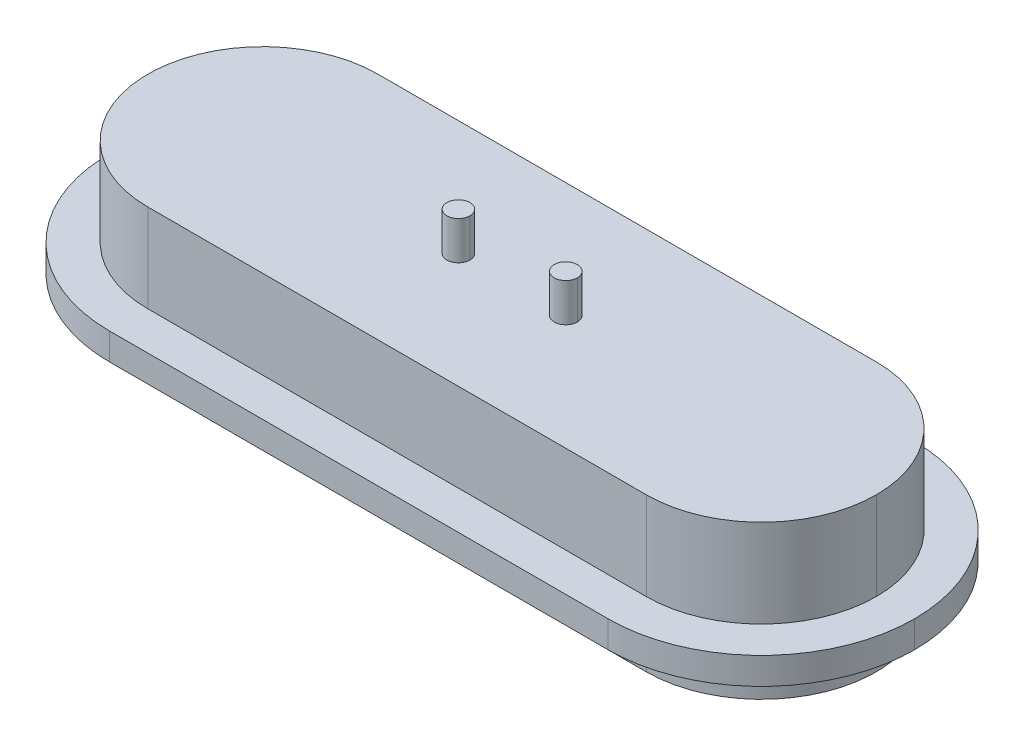
ISO-10303-21;
HEADER;
FILE_DESCRIPTION(('STEP AP214'),'2;1');
FILE_NAME('part.step','',(''),(''),'','','');
FILE_SCHEMA(('AUTOMOTIVE_DESIGN { 1 0 10303 214 1 1 1 1 }'));
ENDSEC;
DATA;
#1=APPLICATION_CONTEXT('core data for automotive mechanical design processes');
#2=APPLICATION_PROTOCOL_DEFINITION('international standard','automotive_design',2000,#1);
#3=PRODUCT_CONTEXT('',#1,'mechanical');
#4=PRODUCT('Part','Part','',(#3));
#5=PRODUCT_RELATED_PRODUCT_CATEGORY('part','',(#4));
#6=PRODUCT_DEFINITION_FORMATION('','',#4);
#7=PRODUCT_DEFINITION_CONTEXT('part definition',#1,'design');
#8=PRODUCT_DEFINITION('design','',#6,#7);
#9=PRODUCT_DEFINITION_SHAPE('','',#8);
#10=(LENGTH_UNIT() NAMED_UNIT(*) SI_UNIT(.MILLI.,.METRE.));
#11=(NAMED_UNIT(*) PLANE_ANGLE_UNIT() SI_UNIT($,.RADIAN.));
#12=(NAMED_UNIT(*) SI_UNIT($,.STERADIAN.) SOLID_ANGLE_UNIT());
#13=UNCERTAINTY_MEASURE_WITH_UNIT(LENGTH_MEASURE(1.E-05),#10,'distance_accuracy_value','');
#14=(GEOMETRIC_REPRESENTATION_CONTEXT(3) GLOBAL_UNCERTAINTY_ASSIGNED_CONTEXT((#13)) GLOBAL_UNIT_ASSIGNED_CONTEXT((#10,
#11,#12)) REPRESENTATION_CONTEXT('',''));
#15=CARTESIAN_POINT('',(0.,0.,0.));
#16=DIRECTION('',(0.,0.,1.));
#17=DIRECTION('',(1.,0.,0.));
#18=AXIS2_PLACEMENT_3D('',#15,#16,#17);
#19=CARTESIAN_POINT('',(-79.4,-62.2625,-2.0116));
#20=DIRECTION('',(0.,-1.,0.));
#21=DIRECTION('',(1.,0.,0.));
#22=AXIS2_PLACEMENT_3D('',#19,#20,#21);
#23=CYLINDRICAL_SURFACE('',#22,0.3);
#24=DIRECTION('',(0.,-1.,0.));
#25=VECTOR('',#24,1.);
#26=CARTESIAN_POINT('',(-79.7,-62.2625,-2.0116));
#27=LINE('',#26,#25);
#28=CARTESIAN_POINT('',(-79.7,-62.2625,-2.0116));
#29=VERTEX_POINT('',#28);
#30=CARTESIAN_POINT('',(-79.7,-63.2625,-2.0116));
#31=VERTEX_POINT('',#30);
#32=EDGE_CURVE('E405',#29,#31,#27,.T.);
#33=ORIENTED_EDGE('',*,*,#32,.F.);
#34=CARTESIAN_POINT('',(-79.4,-62.2625,-2.0116));
#35=DIRECTION('',(0.,-1.,0.));
#36=DIRECTION('',(1.,0.,0.));
#37=AXIS2_PLACEMENT_3D('',#34,#35,#36);
#38=CIRCLE('',#37,0.3);
#39=CARTESIAN_POINT('',(-79.1,-62.2625,-2.0116));
#40=VERTEX_POINT('',#39);
#41=EDGE_CURVE('E11',#29,#40,#38,.T.);
#42=ORIENTED_EDGE('',*,*,#41,.T.);
#43=DIRECTION('',(0.,-1.,0.));
#44=VECTOR('',#43,1.);
#45=CARTESIAN_POINT('',(-79.1,-62.2625,-2.0116));
#46=LINE('',#45,#44);
#47=CARTESIAN_POINT('',(-79.1,-63.2625,-2.0116));
#48=VERTEX_POINT('',#47);
#49=EDGE_CURVE('E413',#40,#48,#46,.T.);
#50=ORIENTED_EDGE('',*,*,#49,.T.);
#51=CARTESIAN_POINT('',(-79.4,-63.2625,-2.0116));
#52=DIRECTION('',(0.,-1.,0.));
#53=DIRECTION('',(-1.,0.,0.));
#54=AXIS2_PLACEMENT_3D('',#51,#52,#53);
#55=CIRCLE('',#54,0.3);
#56=EDGE_CURVE('E295',#31,#48,#55,.T.);
#57=ORIENTED_EDGE('',*,*,#56,.F.);
#58=EDGE_LOOP('',(#33,#42,#50,#57));
#59=FACE_BOUND('',#58,.T.);
#60=ADVANCED_FACE('F16',(#59),#23,.T.);
#61=CARTESIAN_POINT('',(-79.4,-62.2625,-2.0116));
#62=DIRECTION('',(0.,-1.,0.));
#63=DIRECTION('',(0.,0.,-1.));
#64=AXIS2_PLACEMENT_3D('',#61,#62,#63);
#65=PLANE('',#64);
#66=CARTESIAN_POINT('',(-79.4,-62.2625,-2.0116));
#67=DIRECTION('',(0.,-1.,0.));
#68=DIRECTION('',(1.,0.,0.));
#69=AXIS2_PLACEMENT_3D('',#66,#67,#68);
#70=CIRCLE('',#69,0.3);
#71=EDGE_CURVE('E401',#40,#29,#70,.T.);
#72=ORIENTED_EDGE('',*,*,#71,.F.);
#73=ORIENTED_EDGE('',*,*,#41,.F.);
#74=EDGE_LOOP('',(#72,#73));
#75=FACE_BOUND('',#74,.T.);
#76=ADVANCED_FACE('F810',(#75),#65,.F.);
#77=CARTESIAN_POINT('',(-76.6,-62.2625,-2.0116));
#78=DIRECTION('',(0.,-1.,0.));
#79=DIRECTION('',(1.,0.,0.));
#80=AXIS2_PLACEMENT_3D('',#77,#78,#79);
#81=CYLINDRICAL_SURFACE('',#80,0.3);
#82=DIRECTION('',(0.,-1.,0.));
#83=VECTOR('',#82,1.);
#84=CARTESIAN_POINT('',(-76.9,-62.2625,-2.0116));
#85=LINE('',#84,#83);
#86=CARTESIAN_POINT('',(-76.9,-62.2625,-2.0116));
#87=VERTEX_POINT('',#86);
#88=CARTESIAN_POINT('',(-76.9,-63.2625,-2.0116));
#89=VERTEX_POINT('',#88);
#90=EDGE_CURVE('E357',#87,#89,#85,.T.);
#91=ORIENTED_EDGE('',*,*,#90,.F.);
#92=CARTESIAN_POINT('',(-76.6,-62.2625,-2.0116));
#93=DIRECTION('',(0.,-1.,0.));
#94=DIRECTION('',(1.,0.,0.));
#95=AXIS2_PLACEMENT_3D('',#92,#93,#94);
#96=CIRCLE('',#95,0.3);
#97=CARTESIAN_POINT('',(-76.3,-62.2625,-2.0116));
#98=VERTEX_POINT('',#97);
#99=EDGE_CURVE('E27',#87,#98,#96,.T.);
#100=ORIENTED_EDGE('',*,*,#99,.T.);
#101=DIRECTION('',(0.,-1.,0.));
#102=VECTOR('',#101,1.);
#103=CARTESIAN_POINT('',(-76.3,-62.2625,-2.0116));
#104=LINE('',#103,#102);
#105=CARTESIAN_POINT('',(-76.3,-63.2625,-2.0116));
#106=VERTEX_POINT('',#105);
#107=EDGE_CURVE('E286',#98,#106,#104,.T.);
#108=ORIENTED_EDGE('',*,*,#107,.T.);
#109=CARTESIAN_POINT('',(-76.6,-63.2625,-2.0116));
#110=DIRECTION('',(0.,-1.,0.));
#111=DIRECTION('',(-1.,0.,0.));
#112=AXIS2_PLACEMENT_3D('',#109,#110,#111);
#113=CIRCLE('',#112,0.3);
#114=EDGE_CURVE('E292',#89,#106,#113,.T.);
#115=ORIENTED_EDGE('',*,*,#114,.F.);
#116=EDGE_LOOP('',(#91,#100,#108,#115));
#117=FACE_BOUND('',#116,.T.);
#118=ADVANCED_FACE('F18',(#117),#81,.T.);
#119=CARTESIAN_POINT('',(-76.6,-62.2625,-2.0116));
#120=DIRECTION('',(0.,-1.,0.));
#121=DIRECTION('',(0.,0.,-1.));
#122=AXIS2_PLACEMENT_3D('',#119,#120,#121);
#123=PLANE('',#122);
#124=CARTESIAN_POINT('',(-76.6,-62.2625,-2.0116));
#125=DIRECTION('',(0.,-1.,0.));
#126=DIRECTION('',(1.,0.,0.));
#127=AXIS2_PLACEMENT_3D('',#124,#125,#126);
#128=CIRCLE('',#127,0.3);
#129=EDGE_CURVE('E361',#98,#87,#128,.T.);
#130=ORIENTED_EDGE('',*,*,#129,.F.);
#131=ORIENTED_EDGE('',*,*,#99,.F.);
#132=EDGE_LOOP('',(#130,#131));
#133=FACE_BOUND('',#132,.T.);
#134=ADVANCED_FACE('F809',(#133),#123,.F.);
#135=CARTESIAN_POINT('',(-71.5,-63.2625,-2.0116));
#136=DIRECTION('',(0.,1.,0.));
#137=DIRECTION('',(1.,0.,0.));
#138=AXIS2_PLACEMENT_3D('',#135,#136,#137);
#139=PLANE('',#138);
#140=CARTESIAN_POINT('',(-71.5,-63.2625,-2.0116));
#141=DIRECTION('',(0.,1.,0.));
#142=DIRECTION('',(-1.,0.,0.));
#143=AXIS2_PLACEMENT_3D('',#140,#141,#142);
#144=CIRCLE('',#143,3.);
#145=CARTESIAN_POINT('',(-71.5,-63.2625,0.9884));
#146=VERTEX_POINT('',#145);
#147=CARTESIAN_POINT('',(-68.5,-63.2625,-2.0116));
#148=VERTEX_POINT('',#147);
#149=EDGE_CURVE('E304',#146,#148,#144,.T.);
#150=ORIENTED_EDGE('',*,*,#149,.T.);
#151=CARTESIAN_POINT('',(-71.5,-63.2625,-2.0116));
#152=DIRECTION('',(0.,1.,0.));
#153=DIRECTION('',(-1.,0.,0.));
#154=AXIS2_PLACEMENT_3D('',#151,#152,#153);
#155=CIRCLE('',#154,3.);
#156=CARTESIAN_POINT('',(-71.5,-63.2625,-5.0116));
#157=VERTEX_POINT('',#156);
#158=EDGE_CURVE('E279',#148,#157,#155,.T.);
#159=ORIENTED_EDGE('',*,*,#158,.T.);
#160=DIRECTION('',(-1.,0.,0.));
#161=VECTOR('',#160,1.);
#162=CARTESIAN_POINT('',(-71.5,-63.2625,-5.0116));
#163=LINE('',#162,#161);
#164=CARTESIAN_POINT('',(-84.5,-63.2625,-5.0116));
#165=VERTEX_POINT('',#164);
#166=EDGE_CURVE('E347',#157,#165,#163,.T.);
#167=ORIENTED_EDGE('',*,*,#166,.T.);
#168=CARTESIAN_POINT('',(-84.5,-63.2625,-2.0116));
#169=DIRECTION('',(0.,1.,0.));
#170=DIRECTION('',(-1.,0.,0.));
#171=AXIS2_PLACEMENT_3D('',#168,#169,#170);
#172=CIRCLE('',#171,3.);
#173=CARTESIAN_POINT('',(-84.5,-63.2625,0.9884));
#174=VERTEX_POINT('',#173);
#175=EDGE_CURVE('E364',#165,#174,#172,.T.);
#176=ORIENTED_EDGE('',*,*,#175,.T.);
#177=DIRECTION('',(1.,0.,0.));
#178=VECTOR('',#177,1.);
#179=CARTESIAN_POINT('',(-71.5,-63.2625,0.9884));
#180=LINE('',#179,#178);
#181=EDGE_CURVE('E40',#174,#146,#180,.T.);
#182=ORIENTED_EDGE('',*,*,#181,.T.);
#183=EDGE_LOOP('',(#150,#159,#167,#176,#182));
#184=FACE_BOUND('',#183,.T.);
#185=CARTESIAN_POINT('',(-76.6,-63.2625,-2.0116));
#186=DIRECTION('',(0.,-1.,0.));
#187=DIRECTION('',(-1.,0.,0.));
#188=AXIS2_PLACEMENT_3D('',#185,#186,#187);
#189=CIRCLE('',#188,0.3);
#190=EDGE_CURVE('E360',#106,#89,#189,.T.);
#191=ORIENTED_EDGE('',*,*,#190,.T.);
#192=ORIENTED_EDGE('',*,*,#114,.T.);
#193=EDGE_LOOP('',(#191,#192));
#194=FACE_BOUND('',#193,.T.);
#195=CARTESIAN_POINT('',(-79.4,-63.2625,-2.0116));
#196=DIRECTION('',(0.,-1.,0.));
#197=DIRECTION('',(-1.,0.,0.));
#198=AXIS2_PLACEMENT_3D('',#195,#196,#197);
#199=CIRCLE('',#198,0.3);
#200=EDGE_CURVE('E409',#48,#31,#199,.T.);
#201=ORIENTED_EDGE('',*,*,#200,.T.);
#202=ORIENTED_EDGE('',*,*,#56,.T.);
#203=EDGE_LOOP('',(#201,#202));
#204=FACE_BOUND('',#203,.T.);
#205=ADVANCED_FACE('F904',(#184,#194,#204),#139,.T.);
#206=CARTESIAN_POINT('',(-71.5,-63.2625,0.9884));
#207=DIRECTION('',(0.,0.,-1.));
#208=DIRECTION('',(0.,-1.,0.));
#209=AXIS2_PLACEMENT_3D('',#206,#207,#208);
#210=PLANE('',#209);
#211=DIRECTION('',(1.,0.,0.));
#212=VECTOR('',#211,1.);
#213=CARTESIAN_POINT('',(-71.5,-65.5625,0.9884));
#214=LINE('',#213,#212);
#215=CARTESIAN_POINT('',(-84.5,-65.5625,0.9884));
#216=VERTEX_POINT('',#215);
#217=CARTESIAN_POINT('',(-71.5,-65.5625,0.9884));
#218=VERTEX_POINT('',#217);
#219=EDGE_CURVE('E262',#216,#218,#214,.T.);
#220=ORIENTED_EDGE('',*,*,#219,.T.);
#221=DIRECTION('',(0.,-1.,0.));
#222=VECTOR('',#221,1.);
#223=CARTESIAN_POINT('',(-71.5,-63.2625,0.9884));
#224=LINE('',#223,#222);
#225=EDGE_CURVE('E257',#146,#218,#224,.T.);
#226=ORIENTED_EDGE('',*,*,#225,.F.);
#227=ORIENTED_EDGE('',*,*,#181,.F.);
#228=DIRECTION('',(0.,-1.,0.));
#229=VECTOR('',#228,1.);
#230=CARTESIAN_POINT('',(-84.5,-63.2625,0.9884));
#231=LINE('',#230,#229);
#232=EDGE_CURVE('E351',#174,#216,#231,.T.);
#233=ORIENTED_EDGE('',*,*,#232,.T.);
#234=EDGE_LOOP('',(#220,#226,#227,#233));
#235=FACE_BOUND('',#234,.T.);
#236=ADVANCED_FACE('F575',(#235),#210,.F.);
#237=CARTESIAN_POINT('',(-84.5,-63.2625,-2.0116));
#238=DIRECTION('',(0.,-1.,0.));
#239=DIRECTION('',(1.,0.,0.));
#240=AXIS2_PLACEMENT_3D('',#237,#238,#239);
#241=CYLINDRICAL_SURFACE('',#240,3.);
#242=CARTESIAN_POINT('',(-84.5,-65.5625,-2.0116));
#243=DIRECTION('',(0.,1.,0.));
#244=DIRECTION('',(-1.,0.,0.));
#245=AXIS2_PLACEMENT_3D('',#242,#243,#244);
#246=CIRCLE('',#245,3.);
#247=CARTESIAN_POINT('',(-84.5,-65.5625,-5.0116));
#248=VERTEX_POINT('',#247);
#249=EDGE_CURVE('E553',#248,#216,#246,.T.);
#250=ORIENTED_EDGE('',*,*,#249,.T.);
#251=ORIENTED_EDGE('',*,*,#232,.F.);
#252=ORIENTED_EDGE('',*,*,#175,.F.);
#253=DIRECTION('',(0.,-1.,0.));
#254=VECTOR('',#253,1.);
#255=CARTESIAN_POINT('',(-84.5,-63.2625,-5.0116));
#256=LINE('',#255,#254);
#257=EDGE_CURVE('E344',#165,#248,#256,.T.);
#258=ORIENTED_EDGE('',*,*,#257,.T.);
#259=EDGE_LOOP('',(#250,#251,#252,#258));
#260=FACE_BOUND('',#259,.T.);
#261=ADVANCED_FACE('F573',(#260),#241,.T.);
#262=CARTESIAN_POINT('',(-71.5,-63.2625,-5.0116));
#263=DIRECTION('',(0.,0.,1.));
#264=DIRECTION('',(0.,-1.,0.));
#265=AXIS2_PLACEMENT_3D('',#262,#263,#264);
#266=PLANE('',#265);
#267=DIRECTION('',(-1.,0.,0.));
#268=VECTOR('',#267,1.);
#269=CARTESIAN_POINT('',(-71.5,-65.5625,-5.0116));
#270=LINE('',#269,#268);
#271=CARTESIAN_POINT('',(-71.5,-65.5625,-5.0116));
#272=VERTEX_POINT('',#271);
#273=EDGE_CURVE('E263',#272,#248,#270,.T.);
#274=ORIENTED_EDGE('',*,*,#273,.T.);
#275=ORIENTED_EDGE('',*,*,#257,.F.);
#276=ORIENTED_EDGE('',*,*,#166,.F.);
#277=DIRECTION('',(0.,-1.,0.));
#278=VECTOR('',#277,1.);
#279=CARTESIAN_POINT('',(-71.5,-63.2625,-5.0116));
#280=LINE('',#279,#278);
#281=EDGE_CURVE('E275',#157,#272,#280,.T.);
#282=ORIENTED_EDGE('',*,*,#281,.T.);
#283=EDGE_LOOP('',(#274,#275,#276,#282));
#284=FACE_BOUND('',#283,.T.);
#285=ADVANCED_FACE('F874',(#284),#266,.F.);
#286=CARTESIAN_POINT('',(-71.5,-63.2625,-2.0116));
#287=DIRECTION('',(0.,-1.,0.));
#288=DIRECTION('',(1.,0.,0.));
#289=AXIS2_PLACEMENT_3D('',#286,#287,#288);
#290=CYLINDRICAL_SURFACE('',#289,3.);
#291=DIRECTION('',(0.,-1.,0.));
#292=VECTOR('',#291,1.);
#293=CARTESIAN_POINT('',(-68.5,-63.2625,-2.0116));
#294=LINE('',#293,#292);
#295=CARTESIAN_POINT('',(-68.5,-65.5625,-2.0116));
#296=VERTEX_POINT('',#295);
#297=EDGE_CURVE('E255',#148,#296,#294,.T.);
#298=ORIENTED_EDGE('',*,*,#297,.F.);
#299=ORIENTED_EDGE('',*,*,#149,.F.);
#300=ORIENTED_EDGE('',*,*,#225,.T.);
#301=CARTESIAN_POINT('',(-71.5,-65.5625,-2.0116));
#302=DIRECTION('',(0.,1.,0.));
#303=DIRECTION('',(-1.,0.,0.));
#304=AXIS2_PLACEMENT_3D('',#301,#302,#303);
#305=CIRCLE('',#304,3.);
#306=EDGE_CURVE('E250',#218,#296,#305,.T.);
#307=ORIENTED_EDGE('',*,*,#306,.T.);
#308=EDGE_LOOP('',(#298,#299,#300,#307));
#309=FACE_BOUND('',#308,.T.);
#310=ADVANCED_FACE('F252',(#309),#290,.T.);
#311=CARTESIAN_POINT('',(-73.,-67.1125,-2.0116));
#312=DIRECTION('',(0.,-1.,0.));
#313=DIRECTION('',(0.,0.,-1.));
#314=AXIS2_PLACEMENT_3D('',#311,#312,#313);
#315=PLANE('',#314);
#316=CARTESIAN_POINT('',(-73.,-67.1125,-2.0116));
#317=DIRECTION('',(0.,-1.,0.));
#318=DIRECTION('',(1.,0.,0.));
#319=AXIS2_PLACEMENT_3D('',#316,#317,#318);
#320=CIRCLE('',#319,1.25);
#321=CARTESIAN_POINT('',(-71.75,-67.1125,-2.0116));
#322=VERTEX_POINT('',#321);
#323=CARTESIAN_POINT('',(-74.25,-67.1125,-2.0116));
#324=VERTEX_POINT('',#323);
#325=EDGE_CURVE('E302',#322,#324,#320,.T.);
#326=ORIENTED_EDGE('',*,*,#325,.T.);
#327=CARTESIAN_POINT('',(-73.,-67.1125,-2.0116));
#328=DIRECTION('',(0.,-1.,0.));
#329=DIRECTION('',(1.,0.,0.));
#330=AXIS2_PLACEMENT_3D('',#327,#328,#329);
#331=CIRCLE('',#330,1.25);
#332=EDGE_CURVE('E427',#324,#322,#331,.T.);
#333=ORIENTED_EDGE('',*,*,#332,.T.);
#334=EDGE_LOOP('',(#326,#333));
#335=FACE_BOUND('',#334,.T.);
#336=ADVANCED_FACE('F971',(#335),#315,.T.);
#337=CARTESIAN_POINT('',(-73.,-67.1125,-2.0116));
#338=DIRECTION('',(0.,-1.,0.));
#339=DIRECTION('',(1.,0.,0.));
#340=AXIS2_PLACEMENT_3D('',#337,#338,#339);
#341=CYLINDRICAL_SURFACE('',#340,1.25);
#342=DIRECTION('',(0.,-1.,0.));
#343=VECTOR('',#342,1.);
#344=CARTESIAN_POINT('',(-74.25,-67.1125,-2.0116));
#345=LINE('',#344,#343);
#346=CARTESIAN_POINT('',(-74.25,-67.2625,-2.0116));
#347=VERTEX_POINT('',#346);
#348=EDGE_CURVE('E434',#324,#347,#345,.T.);
#349=ORIENTED_EDGE('',*,*,#348,.F.);
#350=ORIENTED_EDGE('',*,*,#325,.F.);
#351=DIRECTION('',(0.,-1.,0.));
#352=VECTOR('',#351,1.);
#353=CARTESIAN_POINT('',(-71.75,-67.1125,-2.0116));
#354=LINE('',#353,#352);
#355=CARTESIAN_POINT('',(-71.75,-67.2625,-2.0116));
#356=VERTEX_POINT('',#355);
#357=EDGE_CURVE('E440',#322,#356,#354,.T.);
#358=ORIENTED_EDGE('',*,*,#357,.T.);
#359=CARTESIAN_POINT('',(-73.,-67.2625,-2.0116));
#360=DIRECTION('',(0.,-1.,0.));
#361=DIRECTION('',(1.,0.,0.));
#362=AXIS2_PLACEMENT_3D('',#359,#360,#361);
#363=CIRCLE('',#362,1.25);
#364=EDGE_CURVE('E428',#356,#347,#363,.T.);
#365=ORIENTED_EDGE('',*,*,#364,.T.);
#366=EDGE_LOOP('',(#349,#350,#358,#365));
#367=FACE_BOUND('',#366,.T.);
#368=ADVANCED_FACE('F895',(#367),#341,.F.);
#369=CARTESIAN_POINT('',(-83.,-67.1125,-2.0116));
#370=DIRECTION('',(0.,1.,0.));
#371=DIRECTION('',(1.,0.,0.));
#372=AXIS2_PLACEMENT_3D('',#369,#370,#371);
#373=PLANE('',#372);
#374=CARTESIAN_POINT('',(-83.,-67.1125,-2.0116));
#375=DIRECTION('',(0.,-1.,0.));
#376=DIRECTION('',(-1.,0.,0.));
#377=AXIS2_PLACEMENT_3D('',#374,#375,#376);
#378=CIRCLE('',#377,1.25);
#379=CARTESIAN_POINT('',(-81.75,-67.1125,-2.0116));
#380=VERTEX_POINT('',#379);
#381=CARTESIAN_POINT('',(-84.25,-67.1125,-2.0116));
#382=VERTEX_POINT('',#381);
#383=EDGE_CURVE('E305',#380,#382,#378,.T.);
#384=ORIENTED_EDGE('',*,*,#383,.T.);
#385=CARTESIAN_POINT('',(-83.,-67.1125,-2.0116));
#386=DIRECTION('',(0.,-1.,0.));
#387=DIRECTION('',(-1.,0.,0.));
#388=AXIS2_PLACEMENT_3D('',#385,#386,#387);
#389=CIRCLE('',#388,1.25);
#390=EDGE_CURVE('E397',#382,#380,#389,.T.);
#391=ORIENTED_EDGE('',*,*,#390,.T.);
#392=EDGE_LOOP('',(#384,#391));
#393=FACE_BOUND('',#392,.T.);
#394=ADVANCED_FACE('F891',(#393),#373,.F.);
#395=CARTESIAN_POINT('',(-83.,-67.1125,-2.0116));
#396=DIRECTION('',(0.,-1.,0.));
#397=DIRECTION('',(1.,0.,0.));
#398=AXIS2_PLACEMENT_3D('',#395,#396,#397);
#399=CYLINDRICAL_SURFACE('',#398,1.25);
#400=DIRECTION('',(0.,-1.,0.));
#401=VECTOR('',#400,1.);
#402=CARTESIAN_POINT('',(-84.25,-67.1125,-2.0116));
#403=LINE('',#402,#401);
#404=CARTESIAN_POINT('',(-84.25,-67.2625,-2.0116));
#405=VERTEX_POINT('',#404);
#406=EDGE_CURVE('E393',#382,#405,#403,.T.);
#407=ORIENTED_EDGE('',*,*,#406,.F.);
#408=ORIENTED_EDGE('',*,*,#383,.F.);
#409=DIRECTION('',(0.,-1.,0.));
#410=VECTOR('',#409,1.);
#411=CARTESIAN_POINT('',(-81.75,-67.1125,-2.0116));
#412=LINE('',#411,#410);
#413=CARTESIAN_POINT('',(-81.75,-67.2625,-2.0116));
#414=VERTEX_POINT('',#413);
#415=EDGE_CURVE('E336',#380,#414,#412,.T.);
#416=ORIENTED_EDGE('',*,*,#415,.T.);
#417=CARTESIAN_POINT('',(-83.,-67.2625,-2.0116));
#418=DIRECTION('',(0.,-1.,0.));
#419=DIRECTION('',(-1.,0.,0.));
#420=AXIS2_PLACEMENT_3D('',#417,#418,#419);
#421=CIRCLE('',#420,1.25);
#422=EDGE_CURVE('E334',#414,#405,#421,.T.);
#423=ORIENTED_EDGE('',*,*,#422,.T.);
#424=EDGE_LOOP('',(#407,#408,#416,#423));
#425=FACE_BOUND('',#424,.T.);
#426=ADVANCED_FACE('F886',(#425),#399,.F.);
#427=CARTESIAN_POINT('',(-79.4,-67.1125,-2.0116));
#428=DIRECTION('',(0.,1.,0.));
#429=DIRECTION('',(1.,0.,0.));
#430=AXIS2_PLACEMENT_3D('',#427,#428,#429);
#431=PLANE('',#430);
#432=CARTESIAN_POINT('',(-79.4,-67.1125,-2.0116));
#433=DIRECTION('',(0.,-1.,0.));
#434=DIRECTION('',(-1.,0.,0.));
#435=AXIS2_PLACEMENT_3D('',#432,#433,#434);
#436=CIRCLE('',#435,0.75);
#437=CARTESIAN_POINT('',(-78.65,-67.1125,-2.0116));
#438=VERTEX_POINT('',#437);
#439=CARTESIAN_POINT('',(-80.15,-67.1125,-2.0116));
#440=VERTEX_POINT('',#439);
#441=EDGE_CURVE('E306',#438,#440,#436,.T.);
#442=ORIENTED_EDGE('',*,*,#441,.T.);
#443=CARTESIAN_POINT('',(-79.4,-67.1125,-2.0116));
#444=DIRECTION('',(0.,-1.,0.));
#445=DIRECTION('',(-1.,0.,0.));
#446=AXIS2_PLACEMENT_3D('',#443,#444,#445);
#447=CIRCLE('',#446,0.75);
#448=EDGE_CURVE('E340',#440,#438,#447,.T.);
#449=ORIENTED_EDGE('',*,*,#448,.T.);
#450=EDGE_LOOP('',(#442,#449));
#451=FACE_BOUND('',#450,.T.);
#452=ADVANCED_FACE('F521',(#451),#431,.F.);
#453=CARTESIAN_POINT('',(-79.4,-67.1125,-2.0116));
#454=DIRECTION('',(0.,-1.,0.));
#455=DIRECTION('',(1.,0.,0.));
#456=AXIS2_PLACEMENT_3D('',#453,#454,#455);
#457=CYLINDRICAL_SURFACE('',#456,0.75);
#458=DIRECTION('',(0.,-1.,0.));
#459=VECTOR('',#458,1.);
#460=CARTESIAN_POINT('',(-80.15,-67.1125,-2.0116));
#461=LINE('',#460,#459);
#462=CARTESIAN_POINT('',(-80.15,-67.2625,-2.0116));
#463=VERTEX_POINT('',#462);
#464=EDGE_CURVE('E380',#440,#463,#461,.T.);
#465=ORIENTED_EDGE('',*,*,#464,.F.);
#466=ORIENTED_EDGE('',*,*,#441,.F.);
#467=DIRECTION('',(0.,-1.,0.));
#468=VECTOR('',#467,1.);
#469=CARTESIAN_POINT('',(-78.65,-67.1125,-2.0116));
#470=LINE('',#469,#468);
#471=CARTESIAN_POINT('',(-78.65,-67.2625,-2.0116));
#472=VERTEX_POINT('',#471);
#473=EDGE_CURVE('E475',#438,#472,#470,.T.);
#474=ORIENTED_EDGE('',*,*,#473,.T.);
#475=CARTESIAN_POINT('',(-79.4,-67.2625,-2.0116));
#476=DIRECTION('',(0.,-1.,0.));
#477=DIRECTION('',(-1.,0.,0.));
#478=AXIS2_PLACEMENT_3D('',#475,#476,#477);
#479=CIRCLE('',#478,0.75);
#480=EDGE_CURVE('E331',#472,#463,#479,.T.);
#481=ORIENTED_EDGE('',*,*,#480,.T.);
#482=EDGE_LOOP('',(#465,#466,#474,#481));
#483=FACE_BOUND('',#482,.T.);
#484=ADVANCED_FACE('F820',(#483),#457,.F.);
#485=CARTESIAN_POINT('',(-76.6,-67.1125,-2.0116));
#486=DIRECTION('',(0.,-1.,0.));
#487=DIRECTION('',(0.,0.,-1.));
#488=AXIS2_PLACEMENT_3D('',#485,#486,#487);
#489=PLANE('',#488);
#490=CARTESIAN_POINT('',(-76.6,-67.1125,-2.0116));
#491=DIRECTION('',(0.,-1.,0.));
#492=DIRECTION('',(1.,0.,0.));
#493=AXIS2_PLACEMENT_3D('',#490,#491,#492);
#494=CIRCLE('',#493,0.75);
#495=CARTESIAN_POINT('',(-75.85,-67.1125,-2.0116));
#496=VERTEX_POINT('',#495);
#497=CARTESIAN_POINT('',(-77.35,-67.1125,-2.0116));
#498=VERTEX_POINT('',#497);
#499=EDGE_CURVE('E308',#496,#498,#494,.T.);
#500=ORIENTED_EDGE('',*,*,#499,.T.);
#501=CARTESIAN_POINT('',(-76.6,-67.1125,-2.0116));
#502=DIRECTION('',(0.,-1.,0.));
#503=DIRECTION('',(1.,0.,0.));
#504=AXIS2_PLACEMENT_3D('',#501,#502,#503);
#505=CIRCLE('',#504,0.75);
#506=EDGE_CURVE('E514',#498,#496,#505,.T.);
#507=ORIENTED_EDGE('',*,*,#506,.T.);
#508=EDGE_LOOP('',(#500,#507));
#509=FACE_BOUND('',#508,.T.);
#510=ADVANCED_FACE('F815',(#509),#489,.T.);
#511=CARTESIAN_POINT('',(-76.6,-67.1125,-2.0116));
#512=DIRECTION('',(0.,-1.,0.));
#513=DIRECTION('',(1.,0.,0.));
#514=AXIS2_PLACEMENT_3D('',#511,#512,#513);
#515=CYLINDRICAL_SURFACE('',#514,0.75);
#516=DIRECTION('',(0.,-1.,0.));
#517=VECTOR('',#516,1.);
#518=CARTESIAN_POINT('',(-77.35,-67.1125,-2.0116));
#519=LINE('',#518,#517);
#520=CARTESIAN_POINT('',(-77.35,-67.2625,-2.0116));
#521=VERTEX_POINT('',#520);
#522=EDGE_CURVE('E509',#498,#521,#519,.T.);
#523=ORIENTED_EDGE('',*,*,#522,.F.);
#524=ORIENTED_EDGE('',*,*,#499,.F.);
#525=DIRECTION('',(0.,-1.,0.));
#526=VECTOR('',#525,1.);
#527=CARTESIAN_POINT('',(-75.85,-67.1125,-2.0116));
#528=LINE('',#527,#526);
#529=CARTESIAN_POINT('',(-75.85,-67.2625,-2.0116));
#530=VERTEX_POINT('',#529);
#531=EDGE_CURVE('E329',#496,#530,#528,.T.);
#532=ORIENTED_EDGE('',*,*,#531,.T.);
#533=CARTESIAN_POINT('',(-76.6,-67.2625,-2.0116));
#534=DIRECTION('',(0.,-1.,0.));
#535=DIRECTION('',(1.,0.,0.));
#536=AXIS2_PLACEMENT_3D('',#533,#534,#535);
#537=CIRCLE('',#536,0.75);
#538=EDGE_CURVE('E333',#530,#521,#537,.T.);
#539=ORIENTED_EDGE('',*,*,#538,.T.);
#540=EDGE_LOOP('',(#523,#524,#532,#539));
#541=FACE_BOUND('',#540,.T.);
#542=ADVANCED_FACE('F819',(#541),#515,.F.);
#543=CARTESIAN_POINT('',(-71.5,-65.5625,1.9884));
#544=DIRECTION('',(0.,0.,-1.));
#545=DIRECTION('',(0.,-1.,0.));
#546=AXIS2_PLACEMENT_3D('',#543,#544,#545);
#547=PLANE('',#546);
#548=DIRECTION('',(1.,0.,0.));
#549=VECTOR('',#548,1.);
#550=CARTESIAN_POINT('',(-71.5,-66.2625,1.9884));
#551=LINE('',#550,#549);
#552=CARTESIAN_POINT('',(-84.5,-66.2625,1.9884));
#553=VERTEX_POINT('',#552);
#554=CARTESIAN_POINT('',(-71.5,-66.2625,1.9884));
#555=VERTEX_POINT('',#554);
#556=EDGE_CURVE('E471',#553,#555,#551,.T.);
#557=ORIENTED_EDGE('',*,*,#556,.T.);
#558=DIRECTION('',(0.,-1.,0.));
#559=VECTOR('',#558,1.);
#560=CARTESIAN_POINT('',(-71.5,-65.5625,1.9884));
#561=LINE('',#560,#559);
#562=CARTESIAN_POINT('',(-71.5,-65.5625,1.9884));
#563=VERTEX_POINT('',#562);
#564=EDGE_CURVE('E447',#563,#555,#561,.T.);
#565=ORIENTED_EDGE('',*,*,#564,.F.);
#566=DIRECTION('',(1.,0.,0.));
#567=VECTOR('',#566,1.);
#568=CARTESIAN_POINT('',(-71.5,-65.5625,1.9884));
#569=LINE('',#568,#567);
#570=CARTESIAN_POINT('',(-84.5,-65.5625,1.9884));
#571=VERTEX_POINT('',#570);
#572=EDGE_CURVE('E435',#571,#563,#569,.T.);
#573=ORIENTED_EDGE('',*,*,#572,.F.);
#574=DIRECTION('',(0.,-1.,0.));
#575=VECTOR('',#574,1.);
#576=CARTESIAN_POINT('',(-84.5,-65.5625,1.9884));
#577=LINE('',#576,#575);
#578=EDGE_CURVE('E317',#571,#553,#577,.T.);
#579=ORIENTED_EDGE('',*,*,#578,.T.);
#580=EDGE_LOOP('',(#557,#565,#573,#579));
#581=FACE_BOUND('',#580,.T.);
#582=ADVANCED_FACE('F1049',(#581),#547,.F.);
#583=CARTESIAN_POINT('',(-84.5,-65.5625,-2.0116));
#584=DIRECTION('',(0.,-1.,0.));
#585=DIRECTION('',(1.,0.,0.));
#586=AXIS2_PLACEMENT_3D('',#583,#584,#585);
#587=CYLINDRICAL_SURFACE('',#586,4.);
#588=CARTESIAN_POINT('',(-84.5,-66.2625,-2.0116));
#589=DIRECTION('',(0.,1.,0.));
#590=DIRECTION('',(-1.,0.,0.));
#591=AXIS2_PLACEMENT_3D('',#588,#589,#590);
#592=CIRCLE('',#591,4.);
#593=CARTESIAN_POINT('',(-84.5,-66.2625,-6.0116));
#594=VERTEX_POINT('',#593);
#595=EDGE_CURVE('E480',#594,#553,#592,.T.);
#596=ORIENTED_EDGE('',*,*,#595,.T.);
#597=ORIENTED_EDGE('',*,*,#578,.F.);
#598=CARTESIAN_POINT('',(-84.5,-65.5625,-2.0116));
#599=DIRECTION('',(0.,1.,0.));
#600=DIRECTION('',(-1.,0.,0.));
#601=AXIS2_PLACEMENT_3D('',#598,#599,#600);
#602=CIRCLE('',#601,4.);
#603=CARTESIAN_POINT('',(-84.5,-65.5625,-6.0116));
#604=VERTEX_POINT('',#603);
#605=EDGE_CURVE('E439',#604,#571,#602,.T.);
#606=ORIENTED_EDGE('',*,*,#605,.F.);
#607=DIRECTION('',(0.,-1.,0.));
#608=VECTOR('',#607,1.);
#609=CARTESIAN_POINT('',(-84.5,-65.5625,-6.0116));
#610=LINE('',#609,#608);
#611=EDGE_CURVE('E325',#604,#594,#610,.T.);
#612=ORIENTED_EDGE('',*,*,#611,.T.);
#613=EDGE_LOOP('',(#596,#597,#606,#612));
#614=FACE_BOUND('',#613,.T.);
#615=ADVANCED_FACE('F829',(#614),#587,.T.);
#616=CARTESIAN_POINT('',(-71.5,-65.5625,-6.0116));
#617=DIRECTION('',(0.,0.,1.));
#618=DIRECTION('',(0.,-1.,0.));
#619=AXIS2_PLACEMENT_3D('',#616,#617,#618);
#620=PLANE('',#619);
#621=DIRECTION('',(-1.,0.,0.));
#622=VECTOR('',#621,1.);
#623=CARTESIAN_POINT('',(-71.5,-66.2625,-6.0116));
#624=LINE('',#623,#622);
#625=CARTESIAN_POINT('',(-71.5,-66.2625,-6.0116));
#626=VERTEX_POINT('',#625);
#627=EDGE_CURVE('E476',#626,#594,#624,.T.);
#628=ORIENTED_EDGE('',*,*,#627,.T.);
#629=ORIENTED_EDGE('',*,*,#611,.F.);
#630=DIRECTION('',(-1.,0.,0.));
#631=VECTOR('',#630,1.);
#632=CARTESIAN_POINT('',(-71.5,-65.5625,-6.0116));
#633=LINE('',#632,#631);
#634=CARTESIAN_POINT('',(-71.5,-65.5625,-6.0116));
#635=VERTEX_POINT('',#634);
#636=EDGE_CURVE('E419',#635,#604,#633,.T.);
#637=ORIENTED_EDGE('',*,*,#636,.F.);
#638=DIRECTION('',(0.,-1.,0.));
#639=VECTOR('',#638,1.);
#640=CARTESIAN_POINT('',(-71.5,-65.5625,-6.0116));
#641=LINE('',#640,#639);
#642=EDGE_CURVE('E550',#635,#626,#641,.T.);
#643=ORIENTED_EDGE('',*,*,#642,.T.);
#644=EDGE_LOOP('',(#628,#629,#637,#643));
#645=FACE_BOUND('',#644,.T.);
#646=ADVANCED_FACE('F824',(#645),#620,.F.);
#647=CARTESIAN_POINT('',(-71.5,-65.5625,-2.0116));
#648=DIRECTION('',(0.,-1.,0.));
#649=DIRECTION('',(1.,0.,0.));
#650=AXIS2_PLACEMENT_3D('',#647,#648,#649);
#651=CYLINDRICAL_SURFACE('',#650,4.);
#652=DIRECTION('',(0.,-1.,0.));
#653=VECTOR('',#652,1.);
#654=CARTESIAN_POINT('',(-67.5,-65.5625,-2.0116));
#655=LINE('',#654,#653);
#656=CARTESIAN_POINT('',(-67.5,-65.5625,-2.0116));
#657=VERTEX_POINT('',#656);
#658=CARTESIAN_POINT('',(-67.5,-66.2625,-2.0116));
#659=VERTEX_POINT('',#658);
#660=EDGE_CURVE('E420',#657,#659,#655,.T.);
#661=ORIENTED_EDGE('',*,*,#660,.F.);
#662=CARTESIAN_POINT('',(-71.5,-65.5625,-2.0116));
#663=DIRECTION('',(0.,1.,0.));
#664=DIRECTION('',(-1.,0.,0.));
#665=AXIS2_PLACEMENT_3D('',#662,#663,#664);
#666=CIRCLE('',#665,4.);
#667=EDGE_CURVE('E389',#563,#657,#666,.T.);
#668=ORIENTED_EDGE('',*,*,#667,.F.);
#669=ORIENTED_EDGE('',*,*,#564,.T.);
#670=CARTESIAN_POINT('',(-71.5,-66.2625,-2.0116));
#671=DIRECTION('',(0.,1.,0.));
#672=DIRECTION('',(-1.,0.,0.));
#673=AXIS2_PLACEMENT_3D('',#670,#671,#672);
#674=CIRCLE('',#673,4.);
#675=EDGE_CURVE('E468',#555,#659,#674,.T.);
#676=ORIENTED_EDGE('',*,*,#675,.T.);
#677=EDGE_LOOP('',(#661,#668,#669,#676));
#678=FACE_BOUND('',#677,.T.);
#679=ADVANCED_FACE('F828',(#678),#651,.T.);
#680=CARTESIAN_POINT('',(-71.5,-66.2625,-2.0116));
#681=DIRECTION('',(0.,1.,0.));
#682=DIRECTION('',(1.,0.,0.));
#683=AXIS2_PLACEMENT_3D('',#680,#681,#682);
#684=PLANE('',#683);
#685=DIRECTION('',(1.,0.,0.));
#686=VECTOR('',#685,1.);
#687=CARTESIAN_POINT('',(-71.5,-66.2625,0.9884));
#688=LINE('',#687,#686);
#689=CARTESIAN_POINT('',(-84.5,-66.2625,0.9884));
#690=VERTEX_POINT('',#689);
#691=CARTESIAN_POINT('',(-71.5,-66.2625,0.9884));
#692=VERTEX_POINT('',#691);
#693=EDGE_CURVE('E301',#690,#692,#688,.T.);
#694=ORIENTED_EDGE('',*,*,#693,.T.);
#695=CARTESIAN_POINT('',(-71.5,-66.2625,-2.0116));
#696=DIRECTION('',(0.,1.,0.));
#697=DIRECTION('',(-1.,0.,0.));
#698=AXIS2_PLACEMENT_3D('',#695,#696,#697);
#699=CIRCLE('',#698,3.);
#700=CARTESIAN_POINT('',(-71.5,-66.2625,-5.0116));
#701=VERTEX_POINT('',#700);
#702=EDGE_CURVE('E554',#692,#701,#699,.T.);
#703=ORIENTED_EDGE('',*,*,#702,.T.);
#704=DIRECTION('',(-1.,0.,0.));
#705=VECTOR('',#704,1.);
#706=CARTESIAN_POINT('',(-71.5,-66.2625,-5.0116));
#707=LINE('',#706,#705);
#708=CARTESIAN_POINT('',(-84.5,-66.2625,-5.0116));
#709=VERTEX_POINT('',#708);
#710=EDGE_CURVE('E352',#701,#709,#707,.T.);
#711=ORIENTED_EDGE('',*,*,#710,.T.);
#712=CARTESIAN_POINT('',(-84.5,-66.2625,-2.0116));
#713=DIRECTION('',(0.,1.,0.));
#714=DIRECTION('',(-1.,0.,0.));
#715=AXIS2_PLACEMENT_3D('',#712,#713,#714);
#716=CIRCLE('',#715,3.);
#717=CARTESIAN_POINT('',(-87.5,-66.2625,-2.0116));
#718=VERTEX_POINT('',#717);
#719=EDGE_CURVE('E290',#709,#718,#716,.T.);
#720=ORIENTED_EDGE('',*,*,#719,.T.);
#721=CARTESIAN_POINT('',(-84.5,-66.2625,-2.0116));
#722=DIRECTION('',(0.,1.,0.));
#723=DIRECTION('',(-1.,0.,0.));
#724=AXIS2_PLACEMENT_3D('',#721,#722,#723);
#725=CIRCLE('',#724,3.);
#726=EDGE_CURVE('E356',#718,#690,#725,.T.);
#727=ORIENTED_EDGE('',*,*,#726,.T.);
#728=EDGE_LOOP('',(#694,#703,#711,#720,#727));
#729=FACE_BOUND('',#728,.T.);
#730=ORIENTED_EDGE('',*,*,#675,.F.);
#731=ORIENTED_EDGE('',*,*,#556,.F.);
#732=ORIENTED_EDGE('',*,*,#595,.F.);
#733=ORIENTED_EDGE('',*,*,#627,.F.);
#734=CARTESIAN_POINT('',(-71.5,-66.2625,-2.0116));
#735=DIRECTION('',(0.,1.,0.));
#736=DIRECTION('',(-1.,0.,0.));
#737=AXIS2_PLACEMENT_3D('',#734,#735,#736);
#738=CIRCLE('',#737,4.);
#739=EDGE_CURVE('E378',#659,#626,#738,.T.);
#740=ORIENTED_EDGE('',*,*,#739,.F.);
#741=EDGE_LOOP('',(#730,#731,#732,#733,#740));
#742=FACE_BOUND('',#741,.T.);
#743=ADVANCED_FACE('F840',(#729,#742),#684,.F.);
#744=CARTESIAN_POINT('',(-71.5,-67.2625,-2.0116));
#745=DIRECTION('',(0.,1.,0.));
#746=DIRECTION('',(1.,0.,0.));
#747=AXIS2_PLACEMENT_3D('',#744,#745,#746);
#748=PLANE('',#747);
#749=CARTESIAN_POINT('',(-71.5,-67.2625,-2.0116));
#750=DIRECTION('',(0.,1.,0.));
#751=DIRECTION('',(-1.,0.,0.));
#752=AXIS2_PLACEMENT_3D('',#749,#750,#751);
#753=CIRCLE('',#752,3.);
#754=CARTESIAN_POINT('',(-71.5,-67.2625,0.9884));
#755=VERTEX_POINT('',#754);
#756=CARTESIAN_POINT('',(-71.5,-67.2625,-5.0116));
#757=VERTEX_POINT('',#756);
#758=EDGE_CURVE('E500',#755,#757,#753,.T.);
#759=ORIENTED_EDGE('',*,*,#758,.F.);
#760=DIRECTION('',(1.,0.,0.));
#761=VECTOR('',#760,1.);
#762=CARTESIAN_POINT('',(-71.5,-67.2625,0.9884));
#763=LINE('',#762,#761);
#764=CARTESIAN_POINT('',(-84.5,-67.2625,0.9884));
#765=VERTEX_POINT('',#764);
#766=EDGE_CURVE('E300',#765,#755,#763,.T.);
#767=ORIENTED_EDGE('',*,*,#766,.F.);
#768=CARTESIAN_POINT('',(-84.5,-67.2625,-2.0116));
#769=DIRECTION('',(0.,1.,0.));
#770=DIRECTION('',(-1.,0.,0.));
#771=AXIS2_PLACEMENT_3D('',#768,#769,#770);
#772=CIRCLE('',#771,3.);
#773=CARTESIAN_POINT('',(-87.5,-67.2625,-2.0116));
#774=VERTEX_POINT('',#773);
#775=EDGE_CURVE('E406',#774,#765,#772,.T.);
#776=ORIENTED_EDGE('',*,*,#775,.F.);
#777=CARTESIAN_POINT('',(-84.5,-67.2625,-2.0116));
#778=DIRECTION('',(0.,1.,0.));
#779=DIRECTION('',(-1.,0.,0.));
#780=AXIS2_PLACEMENT_3D('',#777,#778,#779);
#781=CIRCLE('',#780,3.);
#782=CARTESIAN_POINT('',(-84.5,-67.2625,-5.0116));
#783=VERTEX_POINT('',#782);
#784=EDGE_CURVE('E545',#783,#774,#781,.T.);
#785=ORIENTED_EDGE('',*,*,#784,.F.);
#786=DIRECTION('',(-1.,0.,0.));
#787=VECTOR('',#786,1.);
#788=CARTESIAN_POINT('',(-71.5,-67.2625,-5.0116));
#789=LINE('',#788,#787);
#790=EDGE_CURVE('E355',#757,#783,#789,.T.);
#791=ORIENTED_EDGE('',*,*,#790,.F.);
#792=EDGE_LOOP('',(#759,#767,#776,#785,#791));
#793=FACE_BOUND('',#792,.T.);
#794=ORIENTED_EDGE('',*,*,#538,.F.);
#795=CARTESIAN_POINT('',(-76.6,-67.2625,-2.0116));
#796=DIRECTION('',(0.,-1.,0.));
#797=DIRECTION('',(1.,0.,0.));
#798=AXIS2_PLACEMENT_3D('',#795,#796,#797);
#799=CIRCLE('',#798,0.75);
#800=EDGE_CURVE('E513',#521,#530,#799,.T.);
#801=ORIENTED_EDGE('',*,*,#800,.F.);
#802=EDGE_LOOP('',(#794,#801));
#803=FACE_BOUND('',#802,.T.);
#804=ORIENTED_EDGE('',*,*,#480,.F.);
#805=CARTESIAN_POINT('',(-79.4,-67.2625,-2.0116));
#806=DIRECTION('',(0.,-1.,0.));
#807=DIRECTION('',(-1.,0.,0.));
#808=AXIS2_PLACEMENT_3D('',#805,#806,#807);
#809=CIRCLE('',#808,0.75);
#810=EDGE_CURVE('E384',#463,#472,#809,.T.);
#811=ORIENTED_EDGE('',*,*,#810,.F.);
#812=EDGE_LOOP('',(#804,#811));
#813=FACE_BOUND('',#812,.T.);
#814=ORIENTED_EDGE('',*,*,#422,.F.);
#815=CARTESIAN_POINT('',(-83.,-67.2625,-2.0116));
#816=DIRECTION('',(0.,-1.,0.));
#817=DIRECTION('',(-1.,0.,0.));
#818=AXIS2_PLACEMENT_3D('',#815,#816,#817);
#819=CIRCLE('',#818,1.25);
#820=EDGE_CURVE('E341',#405,#414,#819,.T.);
#821=ORIENTED_EDGE('',*,*,#820,.F.);
#822=EDGE_LOOP('',(#814,#821));
#823=FACE_BOUND('',#822,.T.);
#824=ORIENTED_EDGE('',*,*,#364,.F.);
#825=CARTESIAN_POINT('',(-73.,-67.2625,-2.0116));
#826=DIRECTION('',(0.,-1.,0.));
#827=DIRECTION('',(1.,0.,0.));
#828=AXIS2_PLACEMENT_3D('',#825,#826,#827);
#829=CIRCLE('',#828,1.25);
#830=EDGE_CURVE('E443',#347,#356,#829,.T.);
#831=ORIENTED_EDGE('',*,*,#830,.F.);
#832=EDGE_LOOP('',(#824,#831));
#833=FACE_BOUND('',#832,.T.);
#834=ADVANCED_FACE('F835',(#793,#803,#813,#823,#833),#748,.F.);
#835=CARTESIAN_POINT('',(-71.5,-67.2625,-5.0116));
#836=DIRECTION('',(0.,0.,-1.));
#837=DIRECTION('',(0.,-1.,0.));
#838=AXIS2_PLACEMENT_3D('',#835,#836,#837);
#839=PLANE('',#838);
#840=ORIENTED_EDGE('',*,*,#710,.F.);
#841=DIRECTION('',(0.,1.,0.));
#842=VECTOR('',#841,1.);
#843=CARTESIAN_POINT('',(-71.5,-67.2625,-5.0116));
#844=LINE('',#843,#842);
#845=EDGE_CURVE('E456',#757,#701,#844,.T.);
#846=ORIENTED_EDGE('',*,*,#845,.F.);
#847=ORIENTED_EDGE('',*,*,#790,.T.);
#848=DIRECTION('',(0.,1.,0.));
#849=VECTOR('',#848,1.);
#850=CARTESIAN_POINT('',(-84.5,-67.2625,-5.0116));
#851=LINE('',#850,#849);
#852=EDGE_CURVE('E385',#783,#709,#851,.T.);
#853=ORIENTED_EDGE('',*,*,#852,.T.);
#854=EDGE_LOOP('',(#840,#846,#847,#853));
#855=FACE_BOUND('',#854,.T.);
#856=ADVANCED_FACE('F839',(#855),#839,.T.);
#857=CARTESIAN_POINT('',(-84.5,-67.2625,-2.0116));
#858=DIRECTION('',(0.,1.,0.));
#859=DIRECTION('',(-1.,0.,0.));
#860=AXIS2_PLACEMENT_3D('',#857,#858,#859);
#861=CYLINDRICAL_SURFACE('',#860,3.);
#862=DIRECTION('',(0.,1.,0.));
#863=VECTOR('',#862,1.);
#864=CARTESIAN_POINT('',(-87.5,-67.2625,-2.0116));
#865=LINE('',#864,#863);
#866=EDGE_CURVE('E549',#774,#718,#865,.T.);
#867=ORIENTED_EDGE('',*,*,#866,.F.);
#868=ORIENTED_EDGE('',*,*,#775,.T.);
#869=DIRECTION('',(0.,1.,0.));
#870=VECTOR('',#869,1.);
#871=CARTESIAN_POINT('',(-84.5,-67.2625,0.9884));
#872=LINE('',#871,#870);
#873=EDGE_CURVE('E296',#765,#690,#872,.T.);
#874=ORIENTED_EDGE('',*,*,#873,.T.);
#875=ORIENTED_EDGE('',*,*,#726,.F.);
#876=EDGE_LOOP('',(#867,#868,#874,#875));
#877=FACE_BOUND('',#876,.T.);
#878=ADVANCED_FACE('F921',(#877),#861,.T.);
#879=CARTESIAN_POINT('',(-71.5,-67.2625,0.9884));
#880=DIRECTION('',(0.,0.,1.));
#881=DIRECTION('',(0.,-1.,0.));
#882=AXIS2_PLACEMENT_3D('',#879,#880,#881);
#883=PLANE('',#882);
#884=ORIENTED_EDGE('',*,*,#693,.F.);
#885=ORIENTED_EDGE('',*,*,#873,.F.);
#886=ORIENTED_EDGE('',*,*,#766,.T.);
#887=DIRECTION('',(0.,1.,0.));
#888=VECTOR('',#887,1.);
#889=CARTESIAN_POINT('',(-71.5,-67.2625,0.9884));
#890=LINE('',#889,#888);
#891=EDGE_CURVE('E20',#755,#692,#890,.T.);
#892=ORIENTED_EDGE('',*,*,#891,.T.);
#893=EDGE_LOOP('',(#884,#885,#886,#892));
#894=FACE_BOUND('',#893,.T.);
#895=ADVANCED_FACE('F912',(#894),#883,.T.);
#896=CARTESIAN_POINT('',(-71.5,-67.2625,-2.0116));
#897=DIRECTION('',(0.,1.,0.));
#898=DIRECTION('',(-1.,0.,0.));
#899=AXIS2_PLACEMENT_3D('',#896,#897,#898);
#900=CYLINDRICAL_SURFACE('',#899,3.);
#901=ORIENTED_EDGE('',*,*,#702,.F.);
#902=ORIENTED_EDGE('',*,*,#891,.F.);
#903=ORIENTED_EDGE('',*,*,#758,.T.);
#904=ORIENTED_EDGE('',*,*,#845,.T.);
#905=EDGE_LOOP('',(#901,#902,#903,#904));
#906=FACE_BOUND('',#905,.T.);
#907=ADVANCED_FACE('F850',(#906),#900,.T.);
#908=CARTESIAN_POINT('',(-71.5,-65.5625,-2.0116));
#909=DIRECTION('',(0.,1.,0.));
#910=DIRECTION('',(1.,0.,0.));
#911=AXIS2_PLACEMENT_3D('',#908,#909,#910);
#912=PLANE('',#911);
#913=ORIENTED_EDGE('',*,*,#273,.F.);
#914=CARTESIAN_POINT('',(-71.5,-65.5625,-2.0116));
#915=DIRECTION('',(0.,1.,0.));
#916=DIRECTION('',(-1.,0.,0.));
#917=AXIS2_PLACEMENT_3D('',#914,#915,#916);
#918=CIRCLE('',#917,3.);
#919=EDGE_CURVE('E266',#296,#272,#918,.T.);
#920=ORIENTED_EDGE('',*,*,#919,.F.);
#921=ORIENTED_EDGE('',*,*,#306,.F.);
#922=ORIENTED_EDGE('',*,*,#219,.F.);
#923=ORIENTED_EDGE('',*,*,#249,.F.);
#924=EDGE_LOOP('',(#913,#920,#921,#922,#923));
#925=FACE_BOUND('',#924,.T.);
#926=ORIENTED_EDGE('',*,*,#667,.T.);
#927=CARTESIAN_POINT('',(-71.5,-65.5625,-2.0116));
#928=DIRECTION('',(0.,1.,0.));
#929=DIRECTION('',(-1.,0.,0.));
#930=AXIS2_PLACEMENT_3D('',#927,#928,#929);
#931=CIRCLE('',#930,4.);
#932=EDGE_CURVE('E424',#657,#635,#931,.T.);
#933=ORIENTED_EDGE('',*,*,#932,.T.);
#934=ORIENTED_EDGE('',*,*,#636,.T.);
#935=ORIENTED_EDGE('',*,*,#605,.T.);
#936=ORIENTED_EDGE('',*,*,#572,.T.);
#937=EDGE_LOOP('',(#926,#933,#934,#935,#936));
#938=FACE_BOUND('',#937,.T.);
#939=ADVANCED_FACE('F267',(#925,#938),#912,.T.);
#940=CARTESIAN_POINT('',(-84.5,-67.2625,-2.0116));
#941=DIRECTION('',(0.,1.,0.));
#942=DIRECTION('',(-1.,0.,0.));
#943=AXIS2_PLACEMENT_3D('',#940,#941,#942);
#944=CYLINDRICAL_SURFACE('',#943,3.);
#945=ORIENTED_EDGE('',*,*,#784,.T.);
#946=ORIENTED_EDGE('',*,*,#866,.T.);
#947=ORIENTED_EDGE('',*,*,#719,.F.);
#948=ORIENTED_EDGE('',*,*,#852,.F.);
#949=EDGE_LOOP('',(#945,#946,#947,#948));
#950=FACE_BOUND('',#949,.T.);
#951=ADVANCED_FACE('F849',(#950),#944,.T.);
#952=CARTESIAN_POINT('',(-71.5,-65.5625,-2.0116));
#953=DIRECTION('',(0.,-1.,0.));
#954=DIRECTION('',(1.,0.,0.));
#955=AXIS2_PLACEMENT_3D('',#952,#953,#954);
#956=CYLINDRICAL_SURFACE('',#955,4.);
#957=ORIENTED_EDGE('',*,*,#932,.F.);
#958=ORIENTED_EDGE('',*,*,#660,.T.);
#959=ORIENTED_EDGE('',*,*,#739,.T.);
#960=ORIENTED_EDGE('',*,*,#642,.F.);
#961=EDGE_LOOP('',(#957,#958,#959,#960));
#962=FACE_BOUND('',#961,.T.);
#963=ADVANCED_FACE('F858',(#962),#956,.T.);
#964=CARTESIAN_POINT('',(-76.6,-67.1125,-2.0116));
#965=DIRECTION('',(0.,-1.,0.));
#966=DIRECTION('',(1.,0.,0.));
#967=AXIS2_PLACEMENT_3D('',#964,#965,#966);
#968=CYLINDRICAL_SURFACE('',#967,0.75);
#969=ORIENTED_EDGE('',*,*,#506,.F.);
#970=ORIENTED_EDGE('',*,*,#522,.T.);
#971=ORIENTED_EDGE('',*,*,#800,.T.);
#972=ORIENTED_EDGE('',*,*,#531,.F.);
#973=EDGE_LOOP('',(#969,#970,#971,#972));
#974=FACE_BOUND('',#973,.T.);
#975=ADVANCED_FACE('F1032',(#974),#968,.F.);
#976=CARTESIAN_POINT('',(-79.4,-67.1125,-2.0116));
#977=DIRECTION('',(0.,-1.,0.));
#978=DIRECTION('',(1.,0.,0.));
#979=AXIS2_PLACEMENT_3D('',#976,#977,#978);
#980=CYLINDRICAL_SURFACE('',#979,0.75);
#981=ORIENTED_EDGE('',*,*,#448,.F.);
#982=ORIENTED_EDGE('',*,*,#464,.T.);
#983=ORIENTED_EDGE('',*,*,#810,.T.);
#984=ORIENTED_EDGE('',*,*,#473,.F.);
#985=EDGE_LOOP('',(#981,#982,#983,#984));
#986=FACE_BOUND('',#985,.T.);
#987=ADVANCED_FACE('F524',(#986),#980,.F.);
#988=CARTESIAN_POINT('',(-83.,-67.1125,-2.0116));
#989=DIRECTION('',(0.,-1.,0.));
#990=DIRECTION('',(1.,0.,0.));
#991=AXIS2_PLACEMENT_3D('',#988,#989,#990);
#992=CYLINDRICAL_SURFACE('',#991,1.25);
#993=ORIENTED_EDGE('',*,*,#390,.F.);
#994=ORIENTED_EDGE('',*,*,#406,.T.);
#995=ORIENTED_EDGE('',*,*,#820,.T.);
#996=ORIENTED_EDGE('',*,*,#415,.F.);
#997=EDGE_LOOP('',(#993,#994,#995,#996));
#998=FACE_BOUND('',#997,.T.);
#999=ADVANCED_FACE('F868',(#998),#992,.F.);
#1000=CARTESIAN_POINT('',(-73.,-67.1125,-2.0116));
#1001=DIRECTION('',(0.,-1.,0.));
#1002=DIRECTION('',(1.,0.,0.));
#1003=AXIS2_PLACEMENT_3D('',#1000,#1001,#1002);
#1004=CYLINDRICAL_SURFACE('',#1003,1.25);
#1005=ORIENTED_EDGE('',*,*,#332,.F.);
#1006=ORIENTED_EDGE('',*,*,#348,.T.);
#1007=ORIENTED_EDGE('',*,*,#830,.T.);
#1008=ORIENTED_EDGE('',*,*,#357,.F.);
#1009=EDGE_LOOP('',(#1005,#1006,#1007,#1008));
#1010=FACE_BOUND('',#1009,.T.);
#1011=ADVANCED_FACE('F864',(#1010),#1004,.F.);
#1012=CARTESIAN_POINT('',(-71.5,-63.2625,-2.0116));
#1013=DIRECTION('',(0.,-1.,0.));
#1014=DIRECTION('',(1.,0.,0.));
#1015=AXIS2_PLACEMENT_3D('',#1012,#1013,#1014);
#1016=CYLINDRICAL_SURFACE('',#1015,3.);
#1017=ORIENTED_EDGE('',*,*,#158,.F.);
#1018=ORIENTED_EDGE('',*,*,#297,.T.);
#1019=ORIENTED_EDGE('',*,*,#919,.T.);
#1020=ORIENTED_EDGE('',*,*,#281,.F.);
#1021=EDGE_LOOP('',(#1017,#1018,#1019,#1020));
#1022=FACE_BOUND('',#1021,.T.);
#1023=ADVANCED_FACE('F277',(#1022),#1016,.T.);
#1024=CARTESIAN_POINT('',(-76.6,-62.2625,-2.0116));
#1025=DIRECTION('',(0.,-1.,0.));
#1026=DIRECTION('',(1.,0.,0.));
#1027=AXIS2_PLACEMENT_3D('',#1024,#1025,#1026);
#1028=CYLINDRICAL_SURFACE('',#1027,0.3);
#1029=ORIENTED_EDGE('',*,*,#129,.T.);
#1030=ORIENTED_EDGE('',*,*,#90,.T.);
#1031=ORIENTED_EDGE('',*,*,#190,.F.);
#1032=ORIENTED_EDGE('',*,*,#107,.F.);
#1033=EDGE_LOOP('',(#1029,#1030,#1031,#1032));
#1034=FACE_BOUND('',#1033,.T.);
#1035=ADVANCED_FACE('F950',(#1034),#1028,.T.);
#1036=CARTESIAN_POINT('',(-79.4,-62.2625,-2.0116));
#1037=DIRECTION('',(0.,-1.,0.));
#1038=DIRECTION('',(1.,0.,0.));
#1039=AXIS2_PLACEMENT_3D('',#1036,#1037,#1038);
#1040=CYLINDRICAL_SURFACE('',#1039,0.3);
#1041=ORIENTED_EDGE('',*,*,#71,.T.);
#1042=ORIENTED_EDGE('',*,*,#32,.T.);
#1043=ORIENTED_EDGE('',*,*,#200,.F.);
#1044=ORIENTED_EDGE('',*,*,#49,.F.);
#1045=EDGE_LOOP('',(#1041,#1042,#1043,#1044));
#1046=FACE_BOUND('',#1045,.T.);
#1047=ADVANCED_FACE('F954',(#1046),#1040,.T.);
#1048=CLOSED_SHELL('',(#60,#76,#118,#134,#205,#236,#261,#285,#310,#336,#368,#394,#426,#452,#484,
#510,#542,#582,#615,#646,#679,#743,#834,#856,#878,#895,#907,#939,#951,#963,#975,#987,#999,#1011,
#1023,#1035,#1047));
#1049=MANIFOLD_SOLID_BREP('B1',#1048);
#1050=ADVANCED_BREP_SHAPE_REPRESENTATION('',(#18,#1049),#14);
#1051=SHAPE_DEFINITION_REPRESENTATION(#9,#1050);
ENDSEC;
END-ISO-10303-21;
